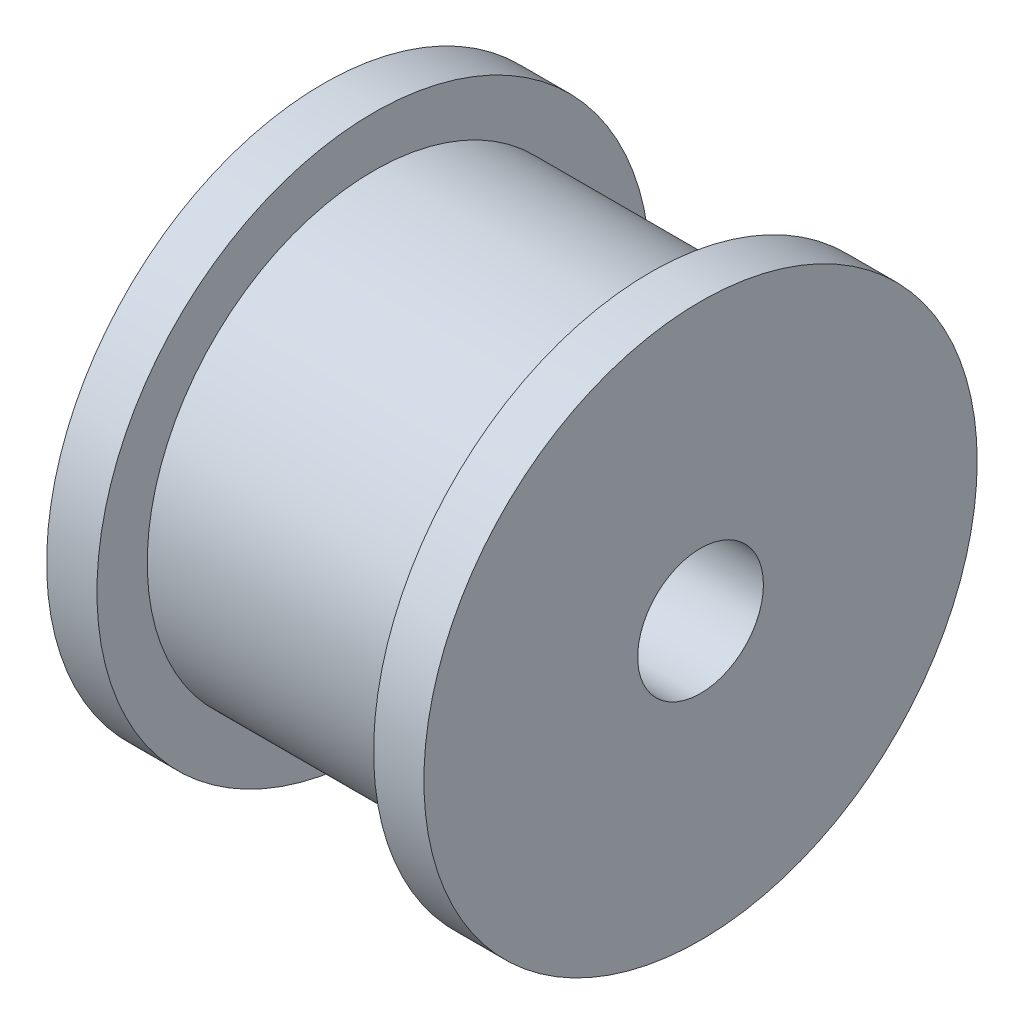
ISO-10303-21;
HEADER;
FILE_DESCRIPTION(('STEP AP214'),'2;1');
FILE_NAME('part.step','',(''),(''),'','','');
FILE_SCHEMA(('AUTOMOTIVE_DESIGN { 1 0 10303 214 1 1 1 1 }'));
ENDSEC;
DATA;
#1=APPLICATION_CONTEXT('core data for automotive mechanical design processes');
#2=APPLICATION_PROTOCOL_DEFINITION('international standard','automotive_design',2000,#1);
#3=PRODUCT_CONTEXT('',#1,'mechanical');
#4=PRODUCT('Part','Part','',(#3));
#5=PRODUCT_RELATED_PRODUCT_CATEGORY('part','',(#4));
#6=PRODUCT_DEFINITION_FORMATION('','',#4);
#7=PRODUCT_DEFINITION_CONTEXT('part definition',#1,'design');
#8=PRODUCT_DEFINITION('design','',#6,#7);
#9=PRODUCT_DEFINITION_SHAPE('','',#8);
#10=(LENGTH_UNIT() NAMED_UNIT(*) SI_UNIT(.MILLI.,.METRE.));
#11=(NAMED_UNIT(*) PLANE_ANGLE_UNIT() SI_UNIT($,.RADIAN.));
#12=(NAMED_UNIT(*) SI_UNIT($,.STERADIAN.) SOLID_ANGLE_UNIT());
#13=UNCERTAINTY_MEASURE_WITH_UNIT(LENGTH_MEASURE(1.E-05),#10,'distance_accuracy_value','');
#14=(GEOMETRIC_REPRESENTATION_CONTEXT(3) GLOBAL_UNCERTAINTY_ASSIGNED_CONTEXT((#13)) GLOBAL_UNIT_ASSIGNED_CONTEXT((#10,
#11,#12)) REPRESENTATION_CONTEXT('',''));
#15=CARTESIAN_POINT('',(0.,0.,0.));
#16=DIRECTION('',(0.,0.,1.));
#17=DIRECTION('',(1.,0.,0.));
#18=AXIS2_PLACEMENT_3D('',#15,#16,#17);
#19=CARTESIAN_POINT('',(2.,0.,0.));
#20=DIRECTION('',(1.,0.,0.));
#21=DIRECTION('',(0.,0.,-1.));
#22=AXIS2_PLACEMENT_3D('',#19,#20,#21);
#23=PLANE('',#22);
#24=CARTESIAN_POINT('',(2.,0.,0.));
#25=DIRECTION('',(1.,0.,0.));
#26=DIRECTION('',(0.,0.,-1.));
#27=AXIS2_PLACEMENT_3D('',#24,#25,#26);
#28=CIRCLE('',#27,9.);
#29=CARTESIAN_POINT('',(2.,0.,-9.));
#30=VERTEX_POINT('',#29);
#31=EDGE_CURVE('E10',#30,#30,#28,.T.);
#32=ORIENTED_EDGE('',*,*,#31,.F.);
#33=EDGE_LOOP('',(#32));
#34=FACE_BOUND('',#33,.T.);
#35=CARTESIAN_POINT('',(2.,0.,0.));
#36=DIRECTION('',(1.,0.,0.));
#37=DIRECTION('',(0.,0.,-1.));
#38=AXIS2_PLACEMENT_3D('',#35,#36,#37);
#39=CIRCLE('',#38,11.);
#40=CARTESIAN_POINT('',(2.,0.,-11.));
#41=VERTEX_POINT('',#40);
#42=EDGE_CURVE('E44',#41,#41,#39,.T.);
#43=ORIENTED_EDGE('',*,*,#42,.T.);
#44=EDGE_LOOP('',(#43));
#45=FACE_BOUND('',#44,.T.);
#46=ADVANCED_FACE('F40',(#34,#45),#23,.T.);
#47=CARTESIAN_POINT('',(0.,0.,0.));
#48=DIRECTION('',(1.,0.,0.));
#49=DIRECTION('',(0.,0.,-1.));
#50=AXIS2_PLACEMENT_3D('',#47,#48,#49);
#51=PLANE('',#50);
#52=CARTESIAN_POINT('',(0.,0.,0.));
#53=DIRECTION('',(1.,0.,0.));
#54=DIRECTION('',(0.,0.,-1.));
#55=AXIS2_PLACEMENT_3D('',#52,#53,#54);
#56=CIRCLE('',#55,11.);
#57=CARTESIAN_POINT('',(0.,0.,-11.));
#58=VERTEX_POINT('',#57);
#59=EDGE_CURVE('E41',#58,#58,#56,.T.);
#60=ORIENTED_EDGE('',*,*,#59,.F.);
#61=EDGE_LOOP('',(#60));
#62=FACE_BOUND('',#61,.T.);
#63=CARTESIAN_POINT('',(0.,0.,0.));
#64=DIRECTION('',(1.,0.,0.));
#65=DIRECTION('',(0.,0.,-1.));
#66=AXIS2_PLACEMENT_3D('',#63,#64,#65);
#67=CIRCLE('',#66,2.5);
#68=CARTESIAN_POINT('',(0.,0.,-2.5));
#69=VERTEX_POINT('',#68);
#70=EDGE_CURVE('E53',#69,#69,#67,.T.);
#71=ORIENTED_EDGE('',*,*,#70,.T.);
#72=EDGE_LOOP('',(#71));
#73=FACE_BOUND('',#72,.T.);
#74=ADVANCED_FACE('F94',(#62,#73),#51,.F.);
#75=CARTESIAN_POINT('',(2.,0.,0.));
#76=DIRECTION('',(-1.,0.,0.));
#77=DIRECTION('',(0.,0.,1.));
#78=AXIS2_PLACEMENT_3D('',#75,#76,#77);
#79=CYLINDRICAL_SURFACE('',#78,11.);
#80=ORIENTED_EDGE('',*,*,#42,.F.);
#81=EDGE_LOOP('',(#80));
#82=FACE_BOUND('',#81,.T.);
#83=ORIENTED_EDGE('',*,*,#59,.T.);
#84=EDGE_LOOP('',(#83));
#85=FACE_BOUND('',#84,.T.);
#86=ADVANCED_FACE('F39',(#82,#85),#79,.T.);
#87=CARTESIAN_POINT('',(2.,0.,0.));
#88=DIRECTION('',(-1.,0.,0.));
#89=DIRECTION('',(0.,0.,1.));
#90=AXIS2_PLACEMENT_3D('',#87,#88,#89);
#91=CYLINDRICAL_SURFACE('',#90,2.5);
#92=ORIENTED_EDGE('',*,*,#70,.F.);
#93=EDGE_LOOP('',(#92));
#94=FACE_BOUND('',#93,.T.);
#95=CARTESIAN_POINT('',(15.,0.,0.));
#96=DIRECTION('',(1.,0.,0.));
#97=DIRECTION('',(0.,0.,-1.));
#98=AXIS2_PLACEMENT_3D('',#95,#96,#97);
#99=CIRCLE('',#98,2.5);
#100=CARTESIAN_POINT('',(15.,0.,-2.5));
#101=VERTEX_POINT('',#100);
#102=EDGE_CURVE('E68',#101,#101,#99,.T.);
#103=ORIENTED_EDGE('',*,*,#102,.T.);
#104=EDGE_LOOP('',(#103));
#105=FACE_BOUND('',#104,.T.);
#106=ADVANCED_FACE('F75',(#94,#105),#91,.F.);
#107=CARTESIAN_POINT('',(13.,0.,0.));
#108=DIRECTION('',(-1.,0.,0.));
#109=DIRECTION('',(0.,0.,1.));
#110=AXIS2_PLACEMENT_3D('',#107,#108,#109);
#111=CYLINDRICAL_SURFACE('',#110,9.);
#112=CARTESIAN_POINT('',(13.,0.,0.));
#113=DIRECTION('',(1.,0.,0.));
#114=DIRECTION('',(0.,0.,-1.));
#115=AXIS2_PLACEMENT_3D('',#112,#113,#114);
#116=CIRCLE('',#115,9.);
#117=CARTESIAN_POINT('',(13.,0.,-9.));
#118=VERTEX_POINT('',#117);
#119=EDGE_CURVE('E55',#118,#118,#116,.T.);
#120=ORIENTED_EDGE('',*,*,#119,.F.);
#121=EDGE_LOOP('',(#120));
#122=FACE_BOUND('',#121,.T.);
#123=ORIENTED_EDGE('',*,*,#31,.T.);
#124=EDGE_LOOP('',(#123));
#125=FACE_BOUND('',#124,.T.);
#126=ADVANCED_FACE('F78',(#122,#125),#111,.T.);
#127=CARTESIAN_POINT('',(15.,0.,0.));
#128=DIRECTION('',(1.,0.,0.));
#129=DIRECTION('',(0.,0.,-1.));
#130=AXIS2_PLACEMENT_3D('',#127,#128,#129);
#131=PLANE('',#130);
#132=CARTESIAN_POINT('',(15.,0.,0.));
#133=DIRECTION('',(1.,0.,0.));
#134=DIRECTION('',(0.,0.,-1.));
#135=AXIS2_PLACEMENT_3D('',#132,#133,#134);
#136=CIRCLE('',#135,11.);
#137=CARTESIAN_POINT('',(15.,0.,-11.));
#138=VERTEX_POINT('',#137);
#139=EDGE_CURVE('E58',#138,#138,#136,.T.);
#140=ORIENTED_EDGE('',*,*,#139,.T.);
#141=EDGE_LOOP('',(#140));
#142=FACE_BOUND('',#141,.T.);
#143=ORIENTED_EDGE('',*,*,#102,.F.);
#144=EDGE_LOOP('',(#143));
#145=FACE_BOUND('',#144,.T.);
#146=ADVANCED_FACE('F76',(#142,#145),#131,.T.);
#147=CARTESIAN_POINT('',(13.,0.,0.));
#148=DIRECTION('',(1.,0.,0.));
#149=DIRECTION('',(0.,0.,-1.));
#150=AXIS2_PLACEMENT_3D('',#147,#148,#149);
#151=PLANE('',#150);
#152=ORIENTED_EDGE('',*,*,#119,.T.);
#153=EDGE_LOOP('',(#152));
#154=FACE_BOUND('',#153,.T.);
#155=CARTESIAN_POINT('',(13.,0.,0.));
#156=DIRECTION('',(1.,0.,0.));
#157=DIRECTION('',(0.,0.,-1.));
#158=AXIS2_PLACEMENT_3D('',#155,#156,#157);
#159=CIRCLE('',#158,11.);
#160=CARTESIAN_POINT('',(13.,0.,-11.));
#161=VERTEX_POINT('',#160);
#162=EDGE_CURVE('E61',#161,#161,#159,.T.);
#163=ORIENTED_EDGE('',*,*,#162,.F.);
#164=EDGE_LOOP('',(#163));
#165=FACE_BOUND('',#164,.T.);
#166=ADVANCED_FACE('F79',(#154,#165),#151,.F.);
#167=CARTESIAN_POINT('',(15.,0.,0.));
#168=DIRECTION('',(-1.,0.,0.));
#169=DIRECTION('',(0.,0.,1.));
#170=AXIS2_PLACEMENT_3D('',#167,#168,#169);
#171=CYLINDRICAL_SURFACE('',#170,11.);
#172=ORIENTED_EDGE('',*,*,#139,.F.);
#173=EDGE_LOOP('',(#172));
#174=FACE_BOUND('',#173,.T.);
#175=ORIENTED_EDGE('',*,*,#162,.T.);
#176=EDGE_LOOP('',(#175));
#177=FACE_BOUND('',#176,.T.);
#178=ADVANCED_FACE('F83',(#174,#177),#171,.T.);
#179=CLOSED_SHELL('',(#46,#74,#86,#106,#126,#146,#166,#178));
#180=MANIFOLD_SOLID_BREP('B2',#179);
#181=ADVANCED_BREP_SHAPE_REPRESENTATION('',(#18,#180),#14);
#182=SHAPE_DEFINITION_REPRESENTATION(#9,#181);
ENDSEC;
END-ISO-10303-21;
